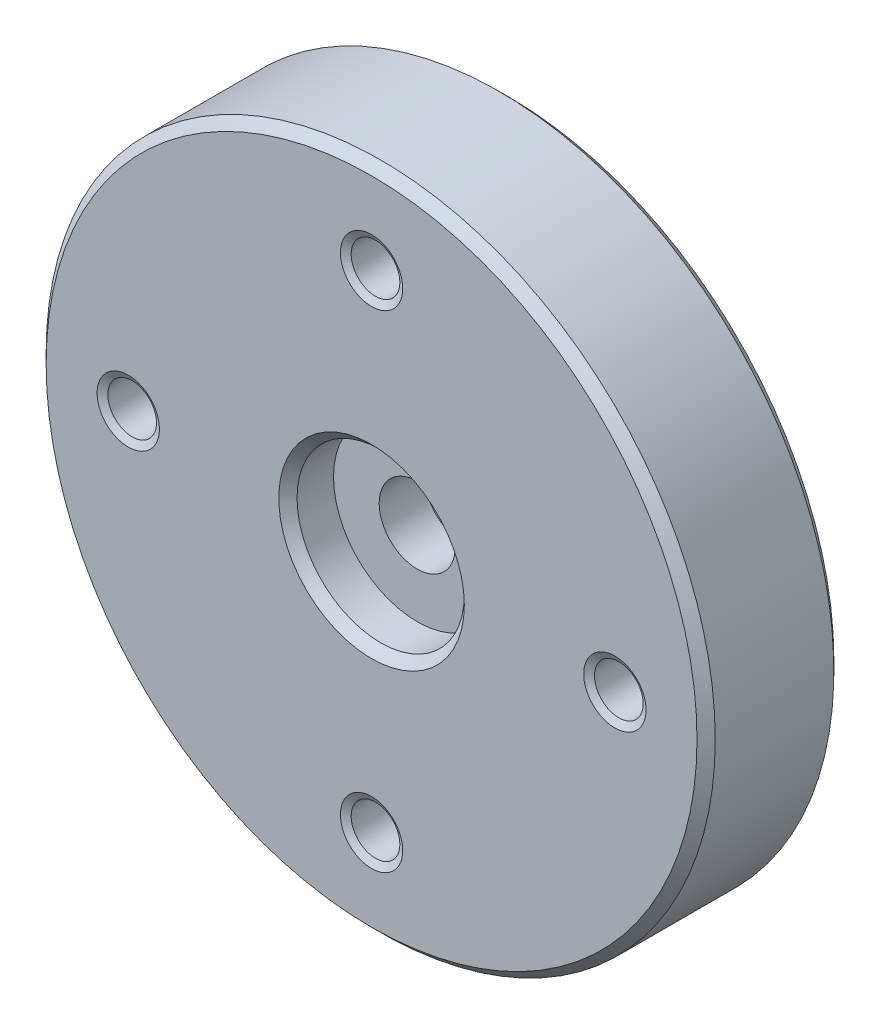
ISO-10303-21;
HEADER;
FILE_DESCRIPTION(('STEP AP214'),'2;1');
FILE_NAME('part.step','',(''),(''),'','','');
FILE_SCHEMA(('AUTOMOTIVE_DESIGN { 1 0 10303 214 1 1 1 1 }'));
ENDSEC;
DATA;
#1=APPLICATION_CONTEXT('core data for automotive mechanical design processes');
#2=APPLICATION_PROTOCOL_DEFINITION('international standard','automotive_design',2000,#1);
#3=PRODUCT_CONTEXT('',#1,'mechanical');
#4=PRODUCT('Part','Part','',(#3));
#5=PRODUCT_RELATED_PRODUCT_CATEGORY('part','',(#4));
#6=PRODUCT_DEFINITION_FORMATION('','',#4);
#7=PRODUCT_DEFINITION_CONTEXT('part definition',#1,'design');
#8=PRODUCT_DEFINITION('design','',#6,#7);
#9=PRODUCT_DEFINITION_SHAPE('','',#8);
#10=(LENGTH_UNIT() NAMED_UNIT(*) SI_UNIT(.MILLI.,.METRE.));
#11=(NAMED_UNIT(*) PLANE_ANGLE_UNIT() SI_UNIT($,.RADIAN.));
#12=(NAMED_UNIT(*) SI_UNIT($,.STERADIAN.) SOLID_ANGLE_UNIT());
#13=UNCERTAINTY_MEASURE_WITH_UNIT(LENGTH_MEASURE(1.E-05),#10,'distance_accuracy_value','');
#14=(GEOMETRIC_REPRESENTATION_CONTEXT(3) GLOBAL_UNCERTAINTY_ASSIGNED_CONTEXT((#13)) GLOBAL_UNIT_ASSIGNED_CONTEXT((#10,
#11,#12)) REPRESENTATION_CONTEXT('',''));
#15=CARTESIAN_POINT('',(0.,0.,0.));
#16=DIRECTION('',(0.,0.,1.));
#17=DIRECTION('',(1.,0.,0.));
#18=AXIS2_PLACEMENT_3D('',#15,#16,#17);
#19=CARTESIAN_POINT('',(0.,0.,0.));
#20=DIRECTION('',(0.,0.,-1.));
#21=DIRECTION('',(-1.,0.,0.));
#22=AXIS2_PLACEMENT_3D('',#19,#20,#21);
#23=CYLINDRICAL_SURFACE('',#22,2.75);
#24=CARTESIAN_POINT('',(0.,0.,-0.300000000000006));
#25=DIRECTION('',(0.,0.,1.));
#26=DIRECTION('',(1.,0.,0.));
#27=AXIS2_PLACEMENT_3D('',#24,#25,#26);
#28=CIRCLE('',#27,2.75);
#29=CARTESIAN_POINT('',(2.75,0.,-0.300000000000006));
#30=VERTEX_POINT('',#29);
#31=EDGE_CURVE('E58',#30,#30,#28,.T.);
#32=ORIENTED_EDGE('',*,*,#31,.T.);
#33=EDGE_LOOP('',(#32));
#34=FACE_BOUND('',#33,.T.);
#35=CARTESIAN_POINT('',(0.,0.,-1.5));
#36=DIRECTION('',(0.,0.,-1.));
#37=DIRECTION('',(-1.,0.,0.));
#38=AXIS2_PLACEMENT_3D('',#35,#36,#37);
#39=CIRCLE('',#38,2.75);
#40=CARTESIAN_POINT('',(-2.75,0.,-1.5));
#41=VERTEX_POINT('',#40);
#42=EDGE_CURVE('E82',#41,#41,#39,.T.);
#43=ORIENTED_EDGE('',*,*,#42,.T.);
#44=EDGE_LOOP('',(#43));
#45=FACE_BOUND('',#44,.T.);
#46=ADVANCED_FACE('F35',(#34,#45),#23,.F.);
#47=CARTESIAN_POINT('',(0.,2.75,0.));
#48=DIRECTION('',(0.,0.,1.));
#49=DIRECTION('',(1.,0.,0.));
#50=AXIS2_PLACEMENT_3D('',#47,#48,#49);
#51=PLANE('',#50);
#52=CARTESIAN_POINT('',(0.,0.,0.));
#53=DIRECTION('',(0.,0.,1.));
#54=DIRECTION('',(1.,0.,0.));
#55=AXIS2_PLACEMENT_3D('',#52,#53,#54);
#56=CIRCLE('',#55,3.05);
#57=CARTESIAN_POINT('',(3.05,0.,0.));
#58=VERTEX_POINT('',#57);
#59=EDGE_CURVE('E61',#58,#58,#56,.F.);
#60=ORIENTED_EDGE('',*,*,#59,.T.);
#61=EDGE_LOOP('',(#60));
#62=FACE_BOUND('',#61,.T.);
#63=CARTESIAN_POINT('',(0.,0.,0.));
#64=DIRECTION('',(0.,0.,1.));
#65=DIRECTION('',(1.,0.,0.));
#66=AXIS2_PLACEMENT_3D('',#63,#64,#65);
#67=CIRCLE('',#66,10.7);
#68=CARTESIAN_POINT('',(10.7,0.,0.));
#69=VERTEX_POINT('',#68);
#70=EDGE_CURVE('E64',#69,#69,#67,.T.);
#71=ORIENTED_EDGE('',*,*,#70,.T.);
#72=EDGE_LOOP('',(#71));
#73=FACE_BOUND('',#72,.T.);
#74=CARTESIAN_POINT('',(0.,8.,0.));
#75=DIRECTION('',(0.,0.,1.));
#76=DIRECTION('',(1.,0.,0.));
#77=AXIS2_PLACEMENT_3D('',#74,#75,#76);
#78=CIRCLE('',#77,1.025);
#79=CARTESIAN_POINT('',(1.025,8.,0.));
#80=VERTEX_POINT('',#79);
#81=EDGE_CURVE('E127',#80,#80,#78,.T.);
#82=ORIENTED_EDGE('',*,*,#81,.F.);
#83=EDGE_LOOP('',(#82));
#84=FACE_BOUND('',#83,.T.);
#85=CARTESIAN_POINT('',(8.,0.,0.));
#86=DIRECTION('',(0.,0.,1.));
#87=DIRECTION('',(1.,0.,0.));
#88=AXIS2_PLACEMENT_3D('',#85,#86,#87);
#89=CIRCLE('',#88,1.025);
#90=CARTESIAN_POINT('',(9.025,0.,0.));
#91=VERTEX_POINT('',#90);
#92=EDGE_CURVE('E115',#91,#91,#89,.T.);
#93=ORIENTED_EDGE('',*,*,#92,.F.);
#94=EDGE_LOOP('',(#93));
#95=FACE_BOUND('',#94,.T.);
#96=CARTESIAN_POINT('',(0.,-8.,0.));
#97=DIRECTION('',(0.,0.,1.));
#98=DIRECTION('',(1.,0.,0.));
#99=AXIS2_PLACEMENT_3D('',#96,#97,#98);
#100=CIRCLE('',#99,1.025);
#101=CARTESIAN_POINT('',(1.025,-8.,0.));
#102=VERTEX_POINT('',#101);
#103=EDGE_CURVE('E103',#102,#102,#100,.T.);
#104=ORIENTED_EDGE('',*,*,#103,.F.);
#105=EDGE_LOOP('',(#104));
#106=FACE_BOUND('',#105,.T.);
#107=CARTESIAN_POINT('',(-8.,0.,0.));
#108=DIRECTION('',(0.,0.,1.));
#109=DIRECTION('',(1.,0.,0.));
#110=AXIS2_PLACEMENT_3D('',#107,#108,#109);
#111=CIRCLE('',#110,1.025);
#112=CARTESIAN_POINT('',(-6.975,0.,0.));
#113=VERTEX_POINT('',#112);
#114=EDGE_CURVE('E91',#113,#113,#111,.T.);
#115=ORIENTED_EDGE('',*,*,#114,.F.);
#116=EDGE_LOOP('',(#115));
#117=FACE_BOUND('',#116,.T.);
#118=ADVANCED_FACE('F157',(#62,#73,#84,#95,#106,#117),#51,.T.);
#119=CARTESIAN_POINT('',(0.,0.,0.));
#120=DIRECTION('',(0.,0.,-1.));
#121=DIRECTION('',(-1.,0.,0.));
#122=AXIS2_PLACEMENT_3D('',#119,#120,#121);
#123=CYLINDRICAL_SURFACE('',#122,11.);
#124=CARTESIAN_POINT('',(0.,0.,-4.2));
#125=DIRECTION('',(0.,0.,-1.));
#126=DIRECTION('',(-1.,0.,0.));
#127=AXIS2_PLACEMENT_3D('',#124,#125,#126);
#128=CIRCLE('',#127,11.);
#129=CARTESIAN_POINT('',(-11.,0.,-4.2));
#130=VERTEX_POINT('',#129);
#131=EDGE_CURVE('E10',#130,#130,#128,.F.);
#132=ORIENTED_EDGE('',*,*,#131,.T.);
#133=EDGE_LOOP('',(#132));
#134=FACE_BOUND('',#133,.T.);
#135=CARTESIAN_POINT('',(0.,0.,-0.299999999999998));
#136=DIRECTION('',(0.,0.,1.));
#137=DIRECTION('',(1.,0.,0.));
#138=AXIS2_PLACEMENT_3D('',#135,#136,#137);
#139=CIRCLE('',#138,11.);
#140=CARTESIAN_POINT('',(11.,0.,-0.299999999999998));
#141=VERTEX_POINT('',#140);
#142=EDGE_CURVE('E42',#141,#141,#139,.F.);
#143=ORIENTED_EDGE('',*,*,#142,.T.);
#144=EDGE_LOOP('',(#143));
#145=FACE_BOUND('',#144,.T.);
#146=ADVANCED_FACE('F160',(#134,#145),#123,.T.);
#147=CARTESIAN_POINT('',(0.,11.,-4.5));
#148=DIRECTION('',(0.,0.,-1.));
#149=DIRECTION('',(-1.,0.,0.));
#150=AXIS2_PLACEMENT_3D('',#147,#148,#149);
#151=PLANE('',#150);
#152=CARTESIAN_POINT('',(0.,0.,-4.5));
#153=DIRECTION('',(0.,0.,-1.));
#154=DIRECTION('',(-1.,0.,0.));
#155=AXIS2_PLACEMENT_3D('',#152,#153,#154);
#156=CIRCLE('',#155,10.7);
#157=CARTESIAN_POINT('',(-10.7,0.,-4.5));
#158=VERTEX_POINT('',#157);
#159=EDGE_CURVE('E46',#158,#158,#156,.T.);
#160=ORIENTED_EDGE('',*,*,#159,.T.);
#161=EDGE_LOOP('',(#160));
#162=FACE_BOUND('',#161,.T.);
#163=CARTESIAN_POINT('',(0.,8.,-4.5));
#164=DIRECTION('',(0.,0.,1.));
#165=DIRECTION('',(1.,0.,0.));
#166=AXIS2_PLACEMENT_3D('',#163,#164,#165);
#167=CIRCLE('',#166,1.025);
#168=CARTESIAN_POINT('',(1.025,8.,-4.5));
#169=VERTEX_POINT('',#168);
#170=EDGE_CURVE('E130',#169,#169,#167,.T.);
#171=ORIENTED_EDGE('',*,*,#170,.T.);
#172=EDGE_LOOP('',(#171));
#173=FACE_BOUND('',#172,.T.);
#174=CARTESIAN_POINT('',(8.,0.,-4.5));
#175=DIRECTION('',(0.,0.,1.));
#176=DIRECTION('',(1.,0.,0.));
#177=AXIS2_PLACEMENT_3D('',#174,#175,#176);
#178=CIRCLE('',#177,1.025);
#179=CARTESIAN_POINT('',(9.025,0.,-4.5));
#180=VERTEX_POINT('',#179);
#181=EDGE_CURVE('E118',#180,#180,#178,.T.);
#182=ORIENTED_EDGE('',*,*,#181,.T.);
#183=EDGE_LOOP('',(#182));
#184=FACE_BOUND('',#183,.T.);
#185=CARTESIAN_POINT('',(0.,-8.,-4.5));
#186=DIRECTION('',(0.,0.,1.));
#187=DIRECTION('',(1.,0.,0.));
#188=AXIS2_PLACEMENT_3D('',#185,#186,#187);
#189=CIRCLE('',#188,1.025);
#190=CARTESIAN_POINT('',(1.025,-8.,-4.5));
#191=VERTEX_POINT('',#190);
#192=EDGE_CURVE('E106',#191,#191,#189,.T.);
#193=ORIENTED_EDGE('',*,*,#192,.T.);
#194=EDGE_LOOP('',(#193));
#195=FACE_BOUND('',#194,.T.);
#196=CARTESIAN_POINT('',(-8.,0.,-4.5));
#197=DIRECTION('',(0.,0.,1.));
#198=DIRECTION('',(1.,0.,0.));
#199=AXIS2_PLACEMENT_3D('',#196,#197,#198);
#200=CIRCLE('',#199,1.025);
#201=CARTESIAN_POINT('',(-6.975,0.,-4.5));
#202=VERTEX_POINT('',#201);
#203=EDGE_CURVE('E94',#202,#202,#200,.T.);
#204=ORIENTED_EDGE('',*,*,#203,.T.);
#205=EDGE_LOOP('',(#204));
#206=FACE_BOUND('',#205,.T.);
#207=CARTESIAN_POINT('',(0.,0.,-4.5));
#208=DIRECTION('',(0.,0.,-1.));
#209=DIRECTION('',(-1.,0.,0.));
#210=AXIS2_PLACEMENT_3D('',#207,#208,#209);
#211=CIRCLE('',#210,4.5);
#212=CARTESIAN_POINT('',(-4.5,0.,-4.5));
#213=VERTEX_POINT('',#212);
#214=EDGE_CURVE('E67',#213,#213,#211,.T.);
#215=ORIENTED_EDGE('',*,*,#214,.F.);
#216=EDGE_LOOP('',(#215));
#217=FACE_BOUND('',#216,.T.);
#218=ADVANCED_FACE('F134',(#162,#173,#184,#195,#206,#217),#151,.T.);
#219=CARTESIAN_POINT('',(0.,0.,0.));
#220=DIRECTION('',(0.,0.,-1.));
#221=DIRECTION('',(-1.,0.,0.));
#222=AXIS2_PLACEMENT_3D('',#219,#220,#221);
#223=CYLINDRICAL_SURFACE('',#222,4.5);
#224=CARTESIAN_POINT('',(0.,0.,-6.4));
#225=DIRECTION('',(0.,0.,-1.));
#226=DIRECTION('',(-1.,0.,0.));
#227=AXIS2_PLACEMENT_3D('',#224,#225,#226);
#228=CIRCLE('',#227,4.5);
#229=CARTESIAN_POINT('',(-4.5,0.,-6.4));
#230=VERTEX_POINT('',#229);
#231=EDGE_CURVE('E50',#230,#230,#228,.F.);
#232=ORIENTED_EDGE('',*,*,#231,.T.);
#233=EDGE_LOOP('',(#232));
#234=FACE_BOUND('',#233,.T.);
#235=ORIENTED_EDGE('',*,*,#214,.T.);
#236=EDGE_LOOP('',(#235));
#237=FACE_BOUND('',#236,.T.);
#238=ADVANCED_FACE('F211',(#234,#237),#223,.T.);
#239=CARTESIAN_POINT('',(0.,4.5,-6.7));
#240=DIRECTION('',(0.,0.,-1.));
#241=DIRECTION('',(-1.,0.,0.));
#242=AXIS2_PLACEMENT_3D('',#239,#240,#241);
#243=PLANE('',#242);
#244=CARTESIAN_POINT('',(0.,0.,-6.7));
#245=DIRECTION('',(0.,0.,-1.));
#246=DIRECTION('',(-1.,0.,0.));
#247=AXIS2_PLACEMENT_3D('',#244,#245,#246);
#248=CIRCLE('',#247,4.2);
#249=CARTESIAN_POINT('',(-4.2,0.,-6.7));
#250=VERTEX_POINT('',#249);
#251=EDGE_CURVE('E55',#250,#250,#248,.T.);
#252=ORIENTED_EDGE('',*,*,#251,.T.);
#253=EDGE_LOOP('',(#252));
#254=FACE_BOUND('',#253,.T.);
#255=CARTESIAN_POINT('',(0.,0.,-6.7));
#256=DIRECTION('',(0.,0.,-1.));
#257=DIRECTION('',(-1.,0.,0.));
#258=AXIS2_PLACEMENT_3D('',#255,#256,#257);
#259=CIRCLE('',#258,2.75);
#260=CARTESIAN_POINT('',(-2.75,0.,-6.7));
#261=VERTEX_POINT('',#260);
#262=EDGE_CURVE('E70',#261,#261,#259,.T.);
#263=ORIENTED_EDGE('',*,*,#262,.F.);
#264=EDGE_LOOP('',(#263));
#265=FACE_BOUND('',#264,.T.);
#266=ADVANCED_FACE('F217',(#254,#265),#243,.T.);
#267=CARTESIAN_POINT('',(0.,0.,0.));
#268=DIRECTION('',(0.,0.,-1.));
#269=DIRECTION('',(-1.,0.,0.));
#270=AXIS2_PLACEMENT_3D('',#267,#268,#269);
#271=CYLINDRICAL_SURFACE('',#270,2.75);
#272=ORIENTED_EDGE('',*,*,#262,.T.);
#273=EDGE_LOOP('',(#272));
#274=FACE_BOUND('',#273,.T.);
#275=CARTESIAN_POINT('',(0.,0.,-3.));
#276=DIRECTION('',(0.,0.,-1.));
#277=DIRECTION('',(-1.,0.,0.));
#278=AXIS2_PLACEMENT_3D('',#275,#276,#277);
#279=CIRCLE('',#278,2.75);
#280=CARTESIAN_POINT('',(-2.75,0.,-3.));
#281=VERTEX_POINT('',#280);
#282=EDGE_CURVE('E73',#281,#281,#279,.T.);
#283=ORIENTED_EDGE('',*,*,#282,.F.);
#284=EDGE_LOOP('',(#283));
#285=FACE_BOUND('',#284,.T.);
#286=ADVANCED_FACE('F223',(#274,#285),#271,.F.);
#287=CARTESIAN_POINT('',(0.,2.75,-3.));
#288=DIRECTION('',(0.,0.,-1.));
#289=DIRECTION('',(-1.,0.,0.));
#290=AXIS2_PLACEMENT_3D('',#287,#288,#289);
#291=PLANE('',#290);
#292=ORIENTED_EDGE('',*,*,#282,.T.);
#293=EDGE_LOOP('',(#292));
#294=FACE_BOUND('',#293,.T.);
#295=CARTESIAN_POINT('',(0.,0.,-3.));
#296=DIRECTION('',(0.,0.,-1.));
#297=DIRECTION('',(-1.,0.,0.));
#298=AXIS2_PLACEMENT_3D('',#295,#296,#297);
#299=CIRCLE('',#298,1.25);
#300=CARTESIAN_POINT('',(-1.25,0.,-3.));
#301=VERTEX_POINT('',#300);
#302=EDGE_CURVE('E76',#301,#301,#299,.T.);
#303=ORIENTED_EDGE('',*,*,#302,.F.);
#304=EDGE_LOOP('',(#303));
#305=FACE_BOUND('',#304,.T.);
#306=ADVANCED_FACE('F227',(#294,#305),#291,.T.);
#307=CARTESIAN_POINT('',(0.,0.,0.));
#308=DIRECTION('',(0.,0.,-1.));
#309=DIRECTION('',(-1.,0.,0.));
#310=AXIS2_PLACEMENT_3D('',#307,#308,#309);
#311=CYLINDRICAL_SURFACE('',#310,1.25);
#312=ORIENTED_EDGE('',*,*,#302,.T.);
#313=EDGE_LOOP('',(#312));
#314=FACE_BOUND('',#313,.T.);
#315=CARTESIAN_POINT('',(0.,0.,-1.5));
#316=DIRECTION('',(0.,0.,-1.));
#317=DIRECTION('',(-1.,0.,0.));
#318=AXIS2_PLACEMENT_3D('',#315,#316,#317);
#319=CIRCLE('',#318,1.25);
#320=CARTESIAN_POINT('',(-1.25,0.,-1.5));
#321=VERTEX_POINT('',#320);
#322=EDGE_CURVE('E79',#321,#321,#319,.T.);
#323=ORIENTED_EDGE('',*,*,#322,.F.);
#324=EDGE_LOOP('',(#323));
#325=FACE_BOUND('',#324,.T.);
#326=ADVANCED_FACE('F231',(#314,#325),#311,.F.);
#327=CARTESIAN_POINT('',(0.,2.75,-1.5));
#328=DIRECTION('',(0.,0.,1.));
#329=DIRECTION('',(1.,0.,0.));
#330=AXIS2_PLACEMENT_3D('',#327,#328,#329);
#331=PLANE('',#330);
#332=ORIENTED_EDGE('',*,*,#322,.T.);
#333=EDGE_LOOP('',(#332));
#334=FACE_BOUND('',#333,.T.);
#335=ORIENTED_EDGE('',*,*,#42,.F.);
#336=EDGE_LOOP('',(#335));
#337=FACE_BOUND('',#336,.T.);
#338=ADVANCED_FACE('F235',(#334,#337),#331,.T.);
#339=CARTESIAN_POINT('',(-8.,0.,-4.37009618943233));
#340=DIRECTION('',(0.,0.,-1.));
#341=DIRECTION('',(-1.,0.,0.));
#342=AXIS2_PLACEMENT_3D('',#339,#340,#341);
#343=CONICAL_SURFACE('',#342,0.799999999999999,1.0471975511966);
#344=ORIENTED_EDGE('',*,*,#203,.F.);
#345=EDGE_LOOP('',(#344));
#346=FACE_BOUND('',#345,.T.);
#347=CARTESIAN_POINT('',(-8.,0.,-4.37009618943233));
#348=DIRECTION('',(0.,0.,1.));
#349=DIRECTION('',(1.,0.,0.));
#350=AXIS2_PLACEMENT_3D('',#347,#348,#349);
#351=CIRCLE('',#350,0.799999999999999);
#352=CARTESIAN_POINT('',(-7.2,0.,-4.37009618943233));
#353=VERTEX_POINT('',#352);
#354=EDGE_CURVE('E85',#353,#353,#351,.T.);
#355=ORIENTED_EDGE('',*,*,#354,.T.);
#356=EDGE_LOOP('',(#355));
#357=FACE_BOUND('',#356,.T.);
#358=ADVANCED_FACE('F182',(#346,#357),#343,.F.);
#359=CARTESIAN_POINT('',(-8.,0.,0.));
#360=DIRECTION('',(0.,0.,1.));
#361=DIRECTION('',(1.,0.,0.));
#362=AXIS2_PLACEMENT_3D('',#359,#360,#361);
#363=CYLINDRICAL_SURFACE('',#362,0.799999999999999);
#364=ORIENTED_EDGE('',*,*,#354,.F.);
#365=EDGE_LOOP('',(#364));
#366=FACE_BOUND('',#365,.T.);
#367=CARTESIAN_POINT('',(-8.,0.,-0.129903810567662));
#368=DIRECTION('',(0.,0.,1.));
#369=DIRECTION('',(1.,0.,0.));
#370=AXIS2_PLACEMENT_3D('',#367,#368,#369);
#371=CIRCLE('',#370,0.8);
#372=CARTESIAN_POINT('',(-7.2,0.,-0.129903810567662));
#373=VERTEX_POINT('',#372);
#374=EDGE_CURVE('E88',#373,#373,#371,.T.);
#375=ORIENTED_EDGE('',*,*,#374,.T.);
#376=EDGE_LOOP('',(#375));
#377=FACE_BOUND('',#376,.T.);
#378=ADVANCED_FACE('F172',(#366,#377),#363,.F.);
#379=CARTESIAN_POINT('',(-8.,0.,0.));
#380=DIRECTION('',(0.,0.,1.));
#381=DIRECTION('',(1.,0.,0.));
#382=AXIS2_PLACEMENT_3D('',#379,#380,#381);
#383=CONICAL_SURFACE('',#382,1.025,1.0471975511966);
#384=ORIENTED_EDGE('',*,*,#374,.F.);
#385=EDGE_LOOP('',(#384));
#386=FACE_BOUND('',#385,.T.);
#387=ORIENTED_EDGE('',*,*,#114,.T.);
#388=EDGE_LOOP('',(#387));
#389=FACE_BOUND('',#388,.T.);
#390=ADVANCED_FACE('F169',(#386,#389),#383,.F.);
#391=CARTESIAN_POINT('',(0.,-8.,-4.37009618943233));
#392=DIRECTION('',(0.,0.,-1.));
#393=DIRECTION('',(-1.,0.,0.));
#394=AXIS2_PLACEMENT_3D('',#391,#392,#393);
#395=CONICAL_SURFACE('',#394,0.799999999999999,1.0471975511966);
#396=ORIENTED_EDGE('',*,*,#192,.F.);
#397=EDGE_LOOP('',(#396));
#398=FACE_BOUND('',#397,.T.);
#399=CARTESIAN_POINT('',(0.,-8.,-4.37009618943233));
#400=DIRECTION('',(0.,0.,1.));
#401=DIRECTION('',(1.,0.,0.));
#402=AXIS2_PLACEMENT_3D('',#399,#400,#401);
#403=CIRCLE('',#402,0.799999999999999);
#404=CARTESIAN_POINT('',(0.799999999999999,-8.,-4.37009618943233));
#405=VERTEX_POINT('',#404);
#406=EDGE_CURVE('E97',#405,#405,#403,.T.);
#407=ORIENTED_EDGE('',*,*,#406,.T.);
#408=EDGE_LOOP('',(#407));
#409=FACE_BOUND('',#408,.T.);
#410=ADVANCED_FACE('F171',(#398,#409),#395,.F.);
#411=CARTESIAN_POINT('',(0.,-8.,0.));
#412=DIRECTION('',(0.,0.,1.));
#413=DIRECTION('',(1.,0.,0.));
#414=AXIS2_PLACEMENT_3D('',#411,#412,#413);
#415=CYLINDRICAL_SURFACE('',#414,0.799999999999999);
#416=ORIENTED_EDGE('',*,*,#406,.F.);
#417=EDGE_LOOP('',(#416));
#418=FACE_BOUND('',#417,.T.);
#419=CARTESIAN_POINT('',(0.,-8.,-0.129903810567662));
#420=DIRECTION('',(0.,0.,1.));
#421=DIRECTION('',(1.,0.,0.));
#422=AXIS2_PLACEMENT_3D('',#419,#420,#421);
#423=CIRCLE('',#422,0.8);
#424=CARTESIAN_POINT('',(0.8,-8.,-0.129903810567662));
#425=VERTEX_POINT('',#424);
#426=EDGE_CURVE('E100',#425,#425,#423,.T.);
#427=ORIENTED_EDGE('',*,*,#426,.T.);
#428=EDGE_LOOP('',(#427));
#429=FACE_BOUND('',#428,.T.);
#430=ADVANCED_FACE('F179',(#418,#429),#415,.F.);
#431=CARTESIAN_POINT('',(0.,-8.,0.));
#432=DIRECTION('',(0.,0.,1.));
#433=DIRECTION('',(1.,0.,0.));
#434=AXIS2_PLACEMENT_3D('',#431,#432,#433);
#435=CONICAL_SURFACE('',#434,1.025,1.0471975511966);
#436=ORIENTED_EDGE('',*,*,#426,.F.);
#437=EDGE_LOOP('',(#436));
#438=FACE_BOUND('',#437,.T.);
#439=ORIENTED_EDGE('',*,*,#103,.T.);
#440=EDGE_LOOP('',(#439));
#441=FACE_BOUND('',#440,.T.);
#442=ADVANCED_FACE('F334',(#438,#441),#435,.F.);
#443=CARTESIAN_POINT('',(8.,0.,-4.37009618943233));
#444=DIRECTION('',(0.,0.,-1.));
#445=DIRECTION('',(-1.,0.,0.));
#446=AXIS2_PLACEMENT_3D('',#443,#444,#445);
#447=CONICAL_SURFACE('',#446,0.799999999999999,1.04719755119659);
#448=ORIENTED_EDGE('',*,*,#181,.F.);
#449=EDGE_LOOP('',(#448));
#450=FACE_BOUND('',#449,.T.);
#451=CARTESIAN_POINT('',(8.,0.,-4.37009618943233));
#452=DIRECTION('',(0.,0.,1.));
#453=DIRECTION('',(1.,0.,0.));
#454=AXIS2_PLACEMENT_3D('',#451,#452,#453);
#455=CIRCLE('',#454,0.799999999999999);
#456=CARTESIAN_POINT('',(8.8,0.,-4.37009618943233));
#457=VERTEX_POINT('',#456);
#458=EDGE_CURVE('E109',#457,#457,#455,.T.);
#459=ORIENTED_EDGE('',*,*,#458,.T.);
#460=EDGE_LOOP('',(#459));
#461=FACE_BOUND('',#460,.T.);
#462=ADVANCED_FACE('F325',(#450,#461),#447,.F.);
#463=CARTESIAN_POINT('',(8.,0.,0.));
#464=DIRECTION('',(0.,0.,1.));
#465=DIRECTION('',(1.,0.,0.));
#466=AXIS2_PLACEMENT_3D('',#463,#464,#465);
#467=CYLINDRICAL_SURFACE('',#466,0.799999999999999);
#468=ORIENTED_EDGE('',*,*,#458,.F.);
#469=EDGE_LOOP('',(#468));
#470=FACE_BOUND('',#469,.T.);
#471=CARTESIAN_POINT('',(8.,0.,-0.129903810567662));
#472=DIRECTION('',(0.,0.,1.));
#473=DIRECTION('',(1.,0.,0.));
#474=AXIS2_PLACEMENT_3D('',#471,#472,#473);
#475=CIRCLE('',#474,0.8);
#476=CARTESIAN_POINT('',(8.8,0.,-0.129903810567662));
#477=VERTEX_POINT('',#476);
#478=EDGE_CURVE('E112',#477,#477,#475,.T.);
#479=ORIENTED_EDGE('',*,*,#478,.T.);
#480=EDGE_LOOP('',(#479));
#481=FACE_BOUND('',#480,.T.);
#482=ADVANCED_FACE('F316',(#470,#481),#467,.F.);
#483=CARTESIAN_POINT('',(8.,0.,0.));
#484=DIRECTION('',(0.,0.,1.));
#485=DIRECTION('',(1.,0.,0.));
#486=AXIS2_PLACEMENT_3D('',#483,#484,#485);
#487=CONICAL_SURFACE('',#486,1.025,1.0471975511966);
#488=ORIENTED_EDGE('',*,*,#478,.F.);
#489=EDGE_LOOP('',(#488));
#490=FACE_BOUND('',#489,.T.);
#491=ORIENTED_EDGE('',*,*,#92,.T.);
#492=EDGE_LOOP('',(#491));
#493=FACE_BOUND('',#492,.T.);
#494=ADVANCED_FACE('F141',(#490,#493),#487,.F.);
#495=CARTESIAN_POINT('',(0.,8.,-4.37009618943233));
#496=DIRECTION('',(0.,0.,-1.));
#497=DIRECTION('',(-1.,0.,0.));
#498=AXIS2_PLACEMENT_3D('',#495,#496,#497);
#499=CONICAL_SURFACE('',#498,0.799999999999999,1.0471975511966);
#500=ORIENTED_EDGE('',*,*,#170,.F.);
#501=EDGE_LOOP('',(#500));
#502=FACE_BOUND('',#501,.T.);
#503=CARTESIAN_POINT('',(0.,8.,-4.37009618943233));
#504=DIRECTION('',(0.,0.,1.));
#505=DIRECTION('',(1.,0.,0.));
#506=AXIS2_PLACEMENT_3D('',#503,#504,#505);
#507=CIRCLE('',#506,0.799999999999999);
#508=CARTESIAN_POINT('',(0.799999999999999,8.,-4.37009618943233));
#509=VERTEX_POINT('',#508);
#510=EDGE_CURVE('E121',#509,#509,#507,.T.);
#511=ORIENTED_EDGE('',*,*,#510,.T.);
#512=EDGE_LOOP('',(#511));
#513=FACE_BOUND('',#512,.T.);
#514=ADVANCED_FACE('F137',(#502,#513),#499,.F.);
#515=CARTESIAN_POINT('',(0.,8.,0.));
#516=DIRECTION('',(0.,0.,1.));
#517=DIRECTION('',(1.,0.,0.));
#518=AXIS2_PLACEMENT_3D('',#515,#516,#517);
#519=CYLINDRICAL_SURFACE('',#518,0.799999999999999);
#520=ORIENTED_EDGE('',*,*,#510,.F.);
#521=EDGE_LOOP('',(#520));
#522=FACE_BOUND('',#521,.T.);
#523=CARTESIAN_POINT('',(0.,8.,-0.129903810567662));
#524=DIRECTION('',(0.,0.,1.));
#525=DIRECTION('',(1.,0.,0.));
#526=AXIS2_PLACEMENT_3D('',#523,#524,#525);
#527=CIRCLE('',#526,0.8);
#528=CARTESIAN_POINT('',(0.8,8.,-0.129903810567662));
#529=VERTEX_POINT('',#528);
#530=EDGE_CURVE('E124',#529,#529,#527,.T.);
#531=ORIENTED_EDGE('',*,*,#530,.T.);
#532=EDGE_LOOP('',(#531));
#533=FACE_BOUND('',#532,.T.);
#534=ADVANCED_FACE('F140',(#522,#533),#519,.F.);
#535=CARTESIAN_POINT('',(0.,8.,0.));
#536=DIRECTION('',(0.,0.,1.));
#537=DIRECTION('',(1.,0.,0.));
#538=AXIS2_PLACEMENT_3D('',#535,#536,#537);
#539=CONICAL_SURFACE('',#538,1.025,1.0471975511966);
#540=ORIENTED_EDGE('',*,*,#530,.F.);
#541=EDGE_LOOP('',(#540));
#542=FACE_BOUND('',#541,.T.);
#543=ORIENTED_EDGE('',*,*,#81,.T.);
#544=EDGE_LOOP('',(#543));
#545=FACE_BOUND('',#544,.T.);
#546=ADVANCED_FACE('F147',(#542,#545),#539,.F.);
#547=CARTESIAN_POINT('',(0.,0.,0.));
#548=DIRECTION('',(0.,0.,1.));
#549=DIRECTION('',(1.,0.,0.));
#550=AXIS2_PLACEMENT_3D('',#547,#548,#549);
#551=CONICAL_SURFACE('',#550,3.05,0.78539816339744);
#552=ORIENTED_EDGE('',*,*,#31,.F.);
#553=EDGE_LOOP('',(#552));
#554=FACE_BOUND('',#553,.T.);
#555=ORIENTED_EDGE('',*,*,#59,.F.);
#556=EDGE_LOOP('',(#555));
#557=FACE_BOUND('',#556,.T.);
#558=ADVANCED_FACE('F153',(#554,#557),#551,.F.);
#559=CARTESIAN_POINT('',(0.,0.,-6.7));
#560=DIRECTION('',(0.,0.,1.));
#561=DIRECTION('',(1.,0.,0.));
#562=AXIS2_PLACEMENT_3D('',#559,#560,#561);
#563=CONICAL_SURFACE('',#562,4.2,0.785398163397445);
#564=ORIENTED_EDGE('',*,*,#231,.F.);
#565=EDGE_LOOP('',(#564));
#566=FACE_BOUND('',#565,.T.);
#567=ORIENTED_EDGE('',*,*,#251,.F.);
#568=EDGE_LOOP('',(#567));
#569=FACE_BOUND('',#568,.T.);
#570=ADVANCED_FACE('F196',(#566,#569),#563,.T.);
#571=CARTESIAN_POINT('',(0.,0.,-4.5));
#572=DIRECTION('',(0.,0.,1.));
#573=DIRECTION('',(1.,0.,0.));
#574=AXIS2_PLACEMENT_3D('',#571,#572,#573);
#575=CONICAL_SURFACE('',#574,10.7,0.785398163397451);
#576=ORIENTED_EDGE('',*,*,#131,.F.);
#577=EDGE_LOOP('',(#576));
#578=FACE_BOUND('',#577,.T.);
#579=ORIENTED_EDGE('',*,*,#159,.F.);
#580=EDGE_LOOP('',(#579));
#581=FACE_BOUND('',#580,.T.);
#582=ADVANCED_FACE('F199',(#578,#581),#575,.T.);
#583=CARTESIAN_POINT('',(0.,0.,-0.299999999999998));
#584=DIRECTION('',(0.,0.,-1.));
#585=DIRECTION('',(-1.,0.,0.));
#586=AXIS2_PLACEMENT_3D('',#583,#584,#585);
#587=CONICAL_SURFACE('',#586,11.,0.785398163397451);
#588=ORIENTED_EDGE('',*,*,#70,.F.);
#589=EDGE_LOOP('',(#588));
#590=FACE_BOUND('',#589,.T.);
#591=ORIENTED_EDGE('',*,*,#142,.F.);
#592=EDGE_LOOP('',(#591));
#593=FACE_BOUND('',#592,.T.);
#594=ADVANCED_FACE('F37',(#590,#593),#587,.T.);
#595=CLOSED_SHELL('',(#46,#118,#146,#218,#238,#266,#286,#306,#326,#338,#358,#378,#390,#410,#430,
#442,#462,#482,#494,#514,#534,#546,#558,#570,#582,#594));
#596=MANIFOLD_SOLID_BREP('B2',#595);
#597=ADVANCED_BREP_SHAPE_REPRESENTATION('',(#18,#596),#14);
#598=SHAPE_DEFINITION_REPRESENTATION(#9,#597);
ENDSEC;
END-ISO-10303-21;
